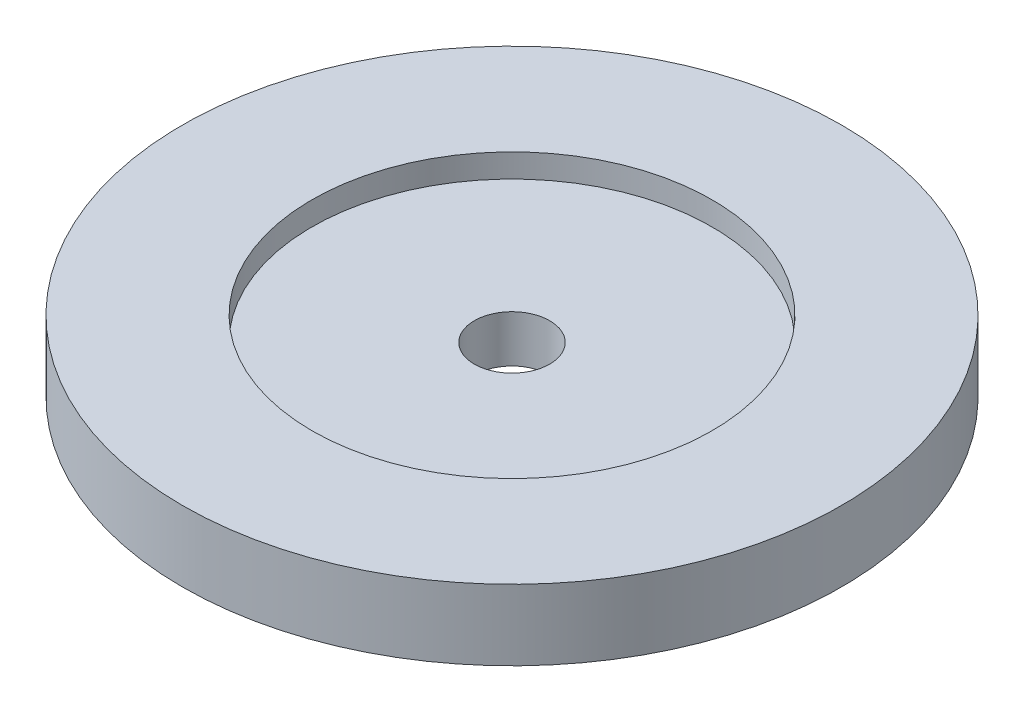
ISO-10303-21;
HEADER;
FILE_DESCRIPTION(('STEP AP214'),'2;1');
FILE_NAME('part.step','',(''),(''),'','','');
FILE_SCHEMA(('AUTOMOTIVE_DESIGN { 1 0 10303 214 1 1 1 1 }'));
ENDSEC;
DATA;
#1=APPLICATION_CONTEXT('core data for automotive mechanical design processes');
#2=APPLICATION_PROTOCOL_DEFINITION('international standard','automotive_design',2000,#1);
#3=PRODUCT_CONTEXT('',#1,'mechanical');
#4=PRODUCT('Part','Part','',(#3));
#5=PRODUCT_RELATED_PRODUCT_CATEGORY('part','',(#4));
#6=PRODUCT_DEFINITION_FORMATION('','',#4);
#7=PRODUCT_DEFINITION_CONTEXT('part definition',#1,'design');
#8=PRODUCT_DEFINITION('design','',#6,#7);
#9=PRODUCT_DEFINITION_SHAPE('','',#8);
#10=(LENGTH_UNIT() NAMED_UNIT(*) SI_UNIT(.MILLI.,.METRE.));
#11=(NAMED_UNIT(*) PLANE_ANGLE_UNIT() SI_UNIT($,.RADIAN.));
#12=(NAMED_UNIT(*) SI_UNIT($,.STERADIAN.) SOLID_ANGLE_UNIT());
#13=UNCERTAINTY_MEASURE_WITH_UNIT(LENGTH_MEASURE(1.E-05),#10,'distance_accuracy_value','');
#14=(GEOMETRIC_REPRESENTATION_CONTEXT(3) GLOBAL_UNCERTAINTY_ASSIGNED_CONTEXT((#13)) GLOBAL_UNIT_ASSIGNED_CONTEXT((#10,
#11,#12)) REPRESENTATION_CONTEXT('',''));
#15=CARTESIAN_POINT('',(0.,0.,0.));
#16=DIRECTION('',(0.,0.,1.));
#17=DIRECTION('',(1.,0.,0.));
#18=AXIS2_PLACEMENT_3D('',#15,#16,#17);
#19=CARTESIAN_POINT('',(0.,3.,0.));
#20=DIRECTION('',(0.,-1.,0.));
#21=DIRECTION('',(0.,0.,-1.));
#22=AXIS2_PLACEMENT_3D('',#19,#20,#21);
#23=CYLINDRICAL_SURFACE('',#22,1.6);
#24=CARTESIAN_POINT('',(0.,0.,0.));
#25=DIRECTION('',(0.,1.,0.));
#26=DIRECTION('',(0.,0.,1.));
#27=AXIS2_PLACEMENT_3D('',#24,#25,#26);
#28=CIRCLE('',#27,1.6);
#29=CARTESIAN_POINT('',(0.,0.,1.6));
#30=VERTEX_POINT('',#29);
#31=EDGE_CURVE('E52',#30,#30,#28,.T.);
#32=ORIENTED_EDGE('',*,*,#31,.F.);
#33=EDGE_LOOP('',(#32));
#34=FACE_BOUND('',#33,.T.);
#35=CARTESIAN_POINT('',(0.,2.,0.));
#36=DIRECTION('',(0.,1.,0.));
#37=DIRECTION('',(0.,0.,1.));
#38=AXIS2_PLACEMENT_3D('',#35,#36,#37);
#39=CIRCLE('',#38,1.6);
#40=CARTESIAN_POINT('',(0.,2.,1.6));
#41=VERTEX_POINT('',#40);
#42=EDGE_CURVE('E41',#41,#41,#39,.T.);
#43=ORIENTED_EDGE('',*,*,#42,.T.);
#44=EDGE_LOOP('',(#43));
#45=FACE_BOUND('',#44,.T.);
#46=ADVANCED_FACE('F37',(#34,#45),#23,.F.);
#47=CARTESIAN_POINT('',(0.,3.,0.));
#48=DIRECTION('',(0.,1.,0.));
#49=DIRECTION('',(0.,0.,1.));
#50=AXIS2_PLACEMENT_3D('',#47,#48,#49);
#51=PLANE('',#50);
#52=CARTESIAN_POINT('',(0.,3.,0.));
#53=DIRECTION('',(0.,1.,0.));
#54=DIRECTION('',(0.,0.,1.));
#55=AXIS2_PLACEMENT_3D('',#52,#53,#54);
#56=CIRCLE('',#55,8.5);
#57=CARTESIAN_POINT('',(0.,3.,8.5));
#58=VERTEX_POINT('',#57);
#59=EDGE_CURVE('E57',#58,#58,#56,.T.);
#60=ORIENTED_EDGE('',*,*,#59,.F.);
#61=EDGE_LOOP('',(#60));
#62=FACE_BOUND('',#61,.T.);
#63=CARTESIAN_POINT('',(0.,3.,0.));
#64=DIRECTION('',(0.,1.,0.));
#65=DIRECTION('',(0.,0.,1.));
#66=AXIS2_PLACEMENT_3D('',#63,#64,#65);
#67=CIRCLE('',#66,14.);
#68=CARTESIAN_POINT('',(0.,3.,14.));
#69=VERTEX_POINT('',#68);
#70=EDGE_CURVE('E10',#69,#69,#67,.T.);
#71=ORIENTED_EDGE('',*,*,#70,.T.);
#72=EDGE_LOOP('',(#71));
#73=FACE_BOUND('',#72,.T.);
#74=ADVANCED_FACE('F81',(#62,#73),#51,.T.);
#75=CARTESIAN_POINT('',(0.,0.,0.));
#76=DIRECTION('',(0.,1.,0.));
#77=DIRECTION('',(0.,0.,1.));
#78=AXIS2_PLACEMENT_3D('',#75,#76,#77);
#79=PLANE('',#78);
#80=CARTESIAN_POINT('',(0.,0.,0.));
#81=DIRECTION('',(0.,1.,0.));
#82=DIRECTION('',(0.,0.,1.));
#83=AXIS2_PLACEMENT_3D('',#80,#81,#82);
#84=CIRCLE('',#83,14.);
#85=CARTESIAN_POINT('',(0.,0.,14.));
#86=VERTEX_POINT('',#85);
#87=EDGE_CURVE('E46',#86,#86,#84,.T.);
#88=ORIENTED_EDGE('',*,*,#87,.F.);
#89=EDGE_LOOP('',(#88));
#90=FACE_BOUND('',#89,.T.);
#91=ORIENTED_EDGE('',*,*,#31,.T.);
#92=EDGE_LOOP('',(#91));
#93=FACE_BOUND('',#92,.T.);
#94=ADVANCED_FACE('F87',(#90,#93),#79,.F.);
#95=CARTESIAN_POINT('',(0.,3.,0.));
#96=DIRECTION('',(0.,-1.,0.));
#97=DIRECTION('',(0.,0.,-1.));
#98=AXIS2_PLACEMENT_3D('',#95,#96,#97);
#99=CYLINDRICAL_SURFACE('',#98,14.);
#100=ORIENTED_EDGE('',*,*,#70,.F.);
#101=EDGE_LOOP('',(#100));
#102=FACE_BOUND('',#101,.T.);
#103=ORIENTED_EDGE('',*,*,#87,.T.);
#104=EDGE_LOOP('',(#103));
#105=FACE_BOUND('',#104,.T.);
#106=ADVANCED_FACE('F39',(#102,#105),#99,.T.);
#107=CARTESIAN_POINT('',(0.,2.,0.));
#108=DIRECTION('',(0.,1.,0.));
#109=DIRECTION('',(0.,0.,1.));
#110=AXIS2_PLACEMENT_3D('',#107,#108,#109);
#111=CYLINDRICAL_SURFACE('',#110,8.5);
#112=CARTESIAN_POINT('',(0.,2.,0.));
#113=DIRECTION('',(0.,1.,0.));
#114=DIRECTION('',(0.,0.,1.));
#115=AXIS2_PLACEMENT_3D('',#112,#113,#114);
#116=CIRCLE('',#115,8.5);
#117=CARTESIAN_POINT('',(0.,2.,8.5));
#118=VERTEX_POINT('',#117);
#119=EDGE_CURVE('E61',#118,#118,#116,.T.);
#120=ORIENTED_EDGE('',*,*,#119,.F.);
#121=EDGE_LOOP('',(#120));
#122=FACE_BOUND('',#121,.T.);
#123=ORIENTED_EDGE('',*,*,#59,.T.);
#124=EDGE_LOOP('',(#123));
#125=FACE_BOUND('',#124,.T.);
#126=ADVANCED_FACE('F73',(#122,#125),#111,.F.);
#127=CARTESIAN_POINT('',(0.,2.,0.));
#128=DIRECTION('',(0.,1.,0.));
#129=DIRECTION('',(0.,0.,1.));
#130=AXIS2_PLACEMENT_3D('',#127,#128,#129);
#131=PLANE('',#130);
#132=ORIENTED_EDGE('',*,*,#42,.F.);
#133=EDGE_LOOP('',(#132));
#134=FACE_BOUND('',#133,.T.);
#135=ORIENTED_EDGE('',*,*,#119,.T.);
#136=EDGE_LOOP('',(#135));
#137=FACE_BOUND('',#136,.T.);
#138=ADVANCED_FACE('F71',(#134,#137),#131,.T.);
#139=CLOSED_SHELL('',(#46,#74,#94,#106,#126,#138));
#140=MANIFOLD_SOLID_BREP('B2',#139);
#141=ADVANCED_BREP_SHAPE_REPRESENTATION('',(#18,#140),#14);
#142=SHAPE_DEFINITION_REPRESENTATION(#9,#141);
ENDSEC;
END-ISO-10303-21;
